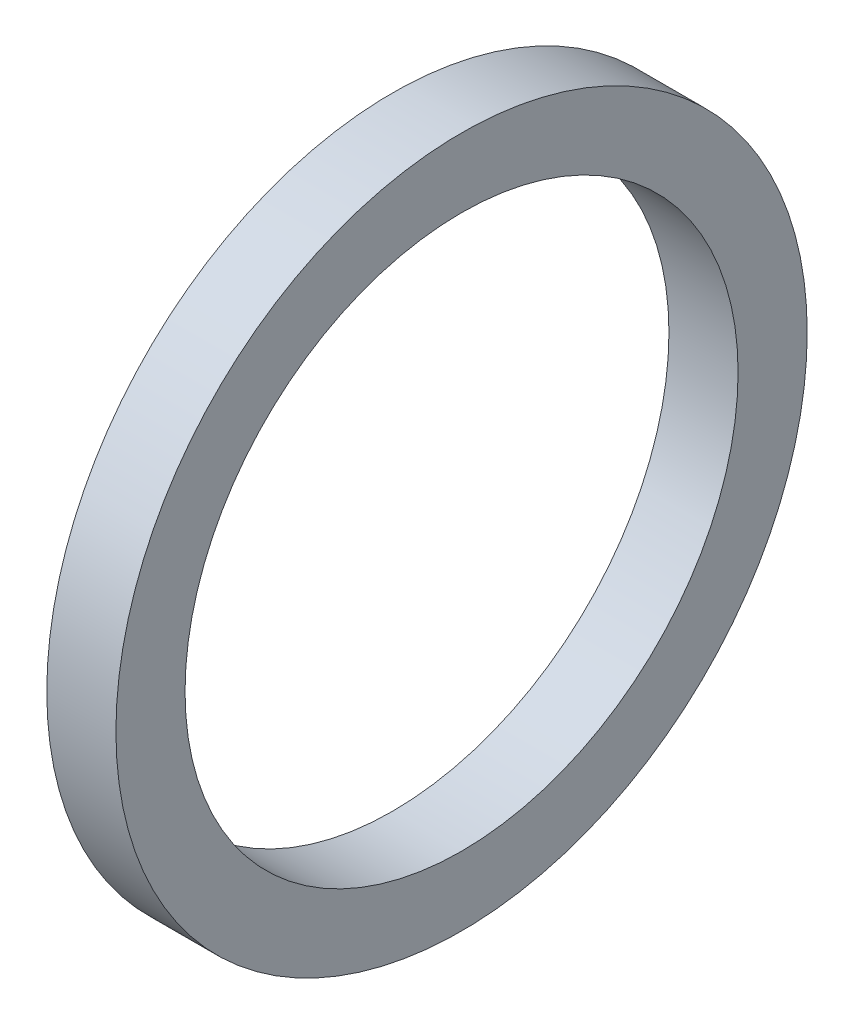
ISO-10303-21;
HEADER;
FILE_DESCRIPTION(('STEP AP214'),'2;1');
FILE_NAME('part.step','',(''),(''),'','','');
FILE_SCHEMA(('AUTOMOTIVE_DESIGN { 1 0 10303 214 1 1 1 1 }'));
ENDSEC;
DATA;
#1=APPLICATION_CONTEXT('core data for automotive mechanical design processes');
#2=APPLICATION_PROTOCOL_DEFINITION('international standard','automotive_design',2000,#1);
#3=PRODUCT_CONTEXT('',#1,'mechanical');
#4=PRODUCT('Part','Part','',(#3));
#5=PRODUCT_RELATED_PRODUCT_CATEGORY('part','',(#4));
#6=PRODUCT_DEFINITION_FORMATION('','',#4);
#7=PRODUCT_DEFINITION_CONTEXT('part definition',#1,'design');
#8=PRODUCT_DEFINITION('design','',#6,#7);
#9=PRODUCT_DEFINITION_SHAPE('','',#8);
#10=(LENGTH_UNIT() NAMED_UNIT(*) SI_UNIT(.MILLI.,.METRE.));
#11=(NAMED_UNIT(*) PLANE_ANGLE_UNIT() SI_UNIT($,.RADIAN.));
#12=(NAMED_UNIT(*) SI_UNIT($,.STERADIAN.) SOLID_ANGLE_UNIT());
#13=UNCERTAINTY_MEASURE_WITH_UNIT(LENGTH_MEASURE(1.E-05),#10,'distance_accuracy_value','');
#14=(GEOMETRIC_REPRESENTATION_CONTEXT(3) GLOBAL_UNCERTAINTY_ASSIGNED_CONTEXT((#13)) GLOBAL_UNIT_ASSIGNED_CONTEXT((#10,
#11,#12)) REPRESENTATION_CONTEXT('',''));
#15=CARTESIAN_POINT('',(0.,0.,0.));
#16=DIRECTION('',(0.,0.,1.));
#17=DIRECTION('',(1.,0.,0.));
#18=AXIS2_PLACEMENT_3D('',#15,#16,#17);
#19=CARTESIAN_POINT('',(1.,0.,0.));
#20=DIRECTION('',(1.,0.,0.));
#21=DIRECTION('',(0.,0.,-1.));
#22=AXIS2_PLACEMENT_3D('',#19,#20,#21);
#23=PLANE('',#22);
#24=CARTESIAN_POINT('',(1.,0.,0.));
#25=DIRECTION('',(1.,0.,0.));
#26=DIRECTION('',(0.,0.,-1.));
#27=AXIS2_PLACEMENT_3D('',#24,#25,#26);
#28=CIRCLE('',#27,5.);
#29=CARTESIAN_POINT('',(1.,0.,-5.));
#30=VERTEX_POINT('',#29);
#31=EDGE_CURVE('E10',#30,#30,#28,.T.);
#32=ORIENTED_EDGE('',*,*,#31,.T.);
#33=EDGE_LOOP('',(#32));
#34=FACE_BOUND('',#33,.T.);
#35=CARTESIAN_POINT('',(1.,0.,0.));
#36=DIRECTION('',(1.,0.,0.));
#37=DIRECTION('',(0.,0.,-1.));
#38=AXIS2_PLACEMENT_3D('',#35,#36,#37);
#39=CIRCLE('',#38,4.);
#40=CARTESIAN_POINT('',(1.,0.,-4.));
#41=VERTEX_POINT('',#40);
#42=EDGE_CURVE('E44',#41,#41,#39,.T.);
#43=ORIENTED_EDGE('',*,*,#42,.F.);
#44=EDGE_LOOP('',(#43));
#45=FACE_BOUND('',#44,.T.);
#46=ADVANCED_FACE('F33',(#34,#45),#23,.T.);
#47=CARTESIAN_POINT('',(0.,0.,0.));
#48=DIRECTION('',(1.,0.,0.));
#49=DIRECTION('',(0.,0.,-1.));
#50=AXIS2_PLACEMENT_3D('',#47,#48,#49);
#51=PLANE('',#50);
#52=CARTESIAN_POINT('',(0.,0.,0.));
#53=DIRECTION('',(1.,0.,0.));
#54=DIRECTION('',(0.,0.,-1.));
#55=AXIS2_PLACEMENT_3D('',#52,#53,#54);
#56=CIRCLE('',#55,5.);
#57=CARTESIAN_POINT('',(0.,0.,-5.));
#58=VERTEX_POINT('',#57);
#59=EDGE_CURVE('E37',#58,#58,#56,.T.);
#60=ORIENTED_EDGE('',*,*,#59,.F.);
#61=EDGE_LOOP('',(#60));
#62=FACE_BOUND('',#61,.T.);
#63=CARTESIAN_POINT('',(0.,0.,0.));
#64=DIRECTION('',(1.,0.,0.));
#65=DIRECTION('',(0.,0.,-1.));
#66=AXIS2_PLACEMENT_3D('',#63,#64,#65);
#67=CIRCLE('',#66,4.);
#68=CARTESIAN_POINT('',(0.,0.,-4.));
#69=VERTEX_POINT('',#68);
#70=EDGE_CURVE('E46',#69,#69,#67,.T.);
#71=ORIENTED_EDGE('',*,*,#70,.T.);
#72=EDGE_LOOP('',(#71));
#73=FACE_BOUND('',#72,.T.);
#74=ADVANCED_FACE('F56',(#62,#73),#51,.F.);
#75=CARTESIAN_POINT('',(1.,0.,0.));
#76=DIRECTION('',(-1.,0.,0.));
#77=DIRECTION('',(0.,0.,1.));
#78=AXIS2_PLACEMENT_3D('',#75,#76,#77);
#79=CYLINDRICAL_SURFACE('',#78,5.);
#80=ORIENTED_EDGE('',*,*,#31,.F.);
#81=EDGE_LOOP('',(#80));
#82=FACE_BOUND('',#81,.T.);
#83=ORIENTED_EDGE('',*,*,#59,.T.);
#84=EDGE_LOOP('',(#83));
#85=FACE_BOUND('',#84,.T.);
#86=ADVANCED_FACE('F35',(#82,#85),#79,.T.);
#87=CARTESIAN_POINT('',(1.,0.,0.));
#88=DIRECTION('',(-1.,0.,0.));
#89=DIRECTION('',(0.,0.,1.));
#90=AXIS2_PLACEMENT_3D('',#87,#88,#89);
#91=CYLINDRICAL_SURFACE('',#90,4.);
#92=ORIENTED_EDGE('',*,*,#42,.T.);
#93=EDGE_LOOP('',(#92));
#94=FACE_BOUND('',#93,.T.);
#95=ORIENTED_EDGE('',*,*,#70,.F.);
#96=EDGE_LOOP('',(#95));
#97=FACE_BOUND('',#96,.T.);
#98=ADVANCED_FACE('F52',(#94,#97),#91,.F.);
#99=CLOSED_SHELL('',(#46,#74,#86,#98));
#100=MANIFOLD_SOLID_BREP('B2',#99);
#101=ADVANCED_BREP_SHAPE_REPRESENTATION('',(#18,#100),#14);
#102=SHAPE_DEFINITION_REPRESENTATION(#9,#101);
ENDSEC;
END-ISO-10303-21;
